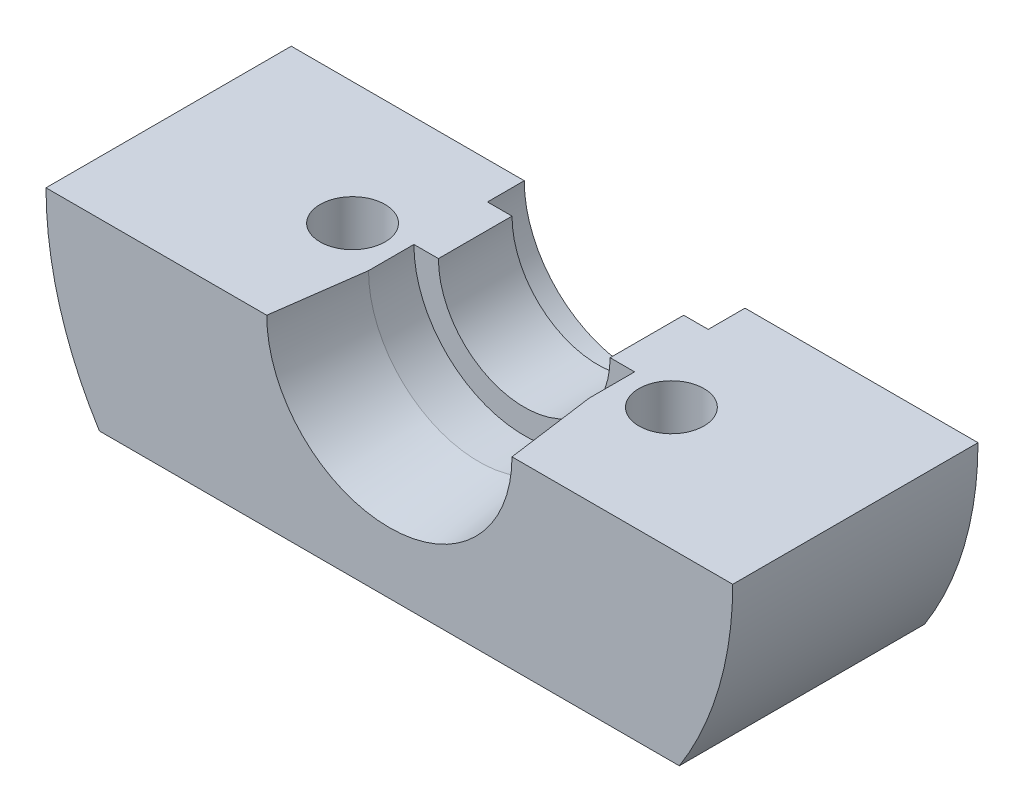
ISO-10303-21;
HEADER;
FILE_DESCRIPTION(('STEP AP214'),'2;1');
FILE_NAME('part.step','',(''),(''),'','','');
FILE_SCHEMA(('AUTOMOTIVE_DESIGN { 1 0 10303 214 1 1 1 1 }'));
ENDSEC;
DATA;
#1=APPLICATION_CONTEXT('core data for automotive mechanical design processes');
#2=APPLICATION_PROTOCOL_DEFINITION('international standard','automotive_design',2000,#1);
#3=PRODUCT_CONTEXT('',#1,'mechanical');
#4=PRODUCT('Part','Part','',(#3));
#5=PRODUCT_RELATED_PRODUCT_CATEGORY('part','',(#4));
#6=PRODUCT_DEFINITION_FORMATION('','',#4);
#7=PRODUCT_DEFINITION_CONTEXT('part definition',#1,'design');
#8=PRODUCT_DEFINITION('design','',#6,#7);
#9=PRODUCT_DEFINITION_SHAPE('','',#8);
#10=(LENGTH_UNIT() NAMED_UNIT(*) SI_UNIT(.MILLI.,.METRE.));
#11=(NAMED_UNIT(*) PLANE_ANGLE_UNIT() SI_UNIT($,.RADIAN.));
#12=(NAMED_UNIT(*) SI_UNIT($,.STERADIAN.) SOLID_ANGLE_UNIT());
#13=UNCERTAINTY_MEASURE_WITH_UNIT(LENGTH_MEASURE(1.E-05),#10,'distance_accuracy_value','');
#14=(GEOMETRIC_REPRESENTATION_CONTEXT(3) GLOBAL_UNCERTAINTY_ASSIGNED_CONTEXT((#13)) GLOBAL_UNIT_ASSIGNED_CONTEXT((#10,
#11,#12)) REPRESENTATION_CONTEXT('',''));
#15=CARTESIAN_POINT('',(0.,0.,0.));
#16=DIRECTION('',(0.,0.,1.));
#17=DIRECTION('',(1.,0.,0.));
#18=AXIS2_PLACEMENT_3D('',#15,#16,#17);
#19=CARTESIAN_POINT('',(0.,0.,-20.));
#20=DIRECTION('',(0.,0.,1.));
#21=DIRECTION('',(1.,0.,0.));
#22=AXIS2_PLACEMENT_3D('',#19,#20,#21);
#23=CYLINDRICAL_SURFACE('',#22,28.);
#24=DIRECTION('',(0.,0.,1.));
#25=VECTOR('',#24,1.);
#26=CARTESIAN_POINT('',(-23.6431808350738,-15.,-20.));
#27=LINE('',#26,#25);
#28=CARTESIAN_POINT('',(-23.6431808350738,-15.,-20.));
#29=VERTEX_POINT('',#28);
#30=CARTESIAN_POINT('',(-23.6431808350738,-15.,0.));
#31=VERTEX_POINT('',#30);
#32=EDGE_CURVE('E120',#29,#31,#27,.T.);
#33=ORIENTED_EDGE('',*,*,#32,.T.);
#34=CARTESIAN_POINT('',(0.,0.,0.));
#35=DIRECTION('',(0.,0.,1.));
#36=DIRECTION('',(1.,0.,0.));
#37=AXIS2_PLACEMENT_3D('',#34,#35,#36);
#38=CIRCLE('',#37,28.);
#39=CARTESIAN_POINT('',(-28.,0.,0.));
#40=VERTEX_POINT('',#39);
#41=EDGE_CURVE('E152',#40,#31,#38,.T.);
#42=ORIENTED_EDGE('',*,*,#41,.F.);
#43=DIRECTION('',(0.,0.,1.));
#44=VECTOR('',#43,1.);
#45=CARTESIAN_POINT('',(-28.,0.,-20.));
#46=LINE('',#45,#44);
#47=CARTESIAN_POINT('',(-28.,0.,-20.));
#48=VERTEX_POINT('',#47);
#49=EDGE_CURVE('E155',#48,#40,#46,.T.);
#50=ORIENTED_EDGE('',*,*,#49,.F.);
#51=CARTESIAN_POINT('',(0.,0.,-20.));
#52=DIRECTION('',(0.,0.,1.));
#53=DIRECTION('',(1.,0.,0.));
#54=AXIS2_PLACEMENT_3D('',#51,#52,#53);
#55=CIRCLE('',#54,28.);
#56=EDGE_CURVE('E139',#48,#29,#55,.T.);
#57=ORIENTED_EDGE('',*,*,#56,.T.);
#58=EDGE_LOOP('',(#33,#42,#50,#57));
#59=FACE_BOUND('',#58,.T.);
#60=ADVANCED_FACE('F33',(#59),#23,.T.);
#61=CARTESIAN_POINT('',(13.,0.,-10.));
#62=DIRECTION('',(0.,1.,0.));
#63=DIRECTION('',(0.,0.,1.));
#64=AXIS2_PLACEMENT_3D('',#61,#62,#63);
#65=CYLINDRICAL_SURFACE('',#64,2.64999999999999);
#66=CARTESIAN_POINT('',(13.,0.,-10.));
#67=DIRECTION('',(0.,1.,0.));
#68=DIRECTION('',(0.,0.,1.));
#69=AXIS2_PLACEMENT_3D('',#66,#67,#68);
#70=CIRCLE('',#69,2.65);
#71=CARTESIAN_POINT('',(13.,0.,-7.35000000000001));
#72=VERTEX_POINT('',#71);
#73=EDGE_CURVE('E183',#72,#72,#70,.T.);
#74=ORIENTED_EDGE('',*,*,#73,.T.);
#75=EDGE_LOOP('',(#74));
#76=FACE_BOUND('',#75,.T.);
#77=CARTESIAN_POINT('',(13.,-8.,-10.));
#78=DIRECTION('',(0.,-1.,0.));
#79=DIRECTION('',(0.,0.,-1.));
#80=AXIS2_PLACEMENT_3D('',#77,#78,#79);
#81=CIRCLE('',#80,2.64999999999999);
#82=CARTESIAN_POINT('',(13.,-8.,-12.65));
#83=VERTEX_POINT('',#82);
#84=EDGE_CURVE('E176',#83,#83,#81,.F.);
#85=ORIENTED_EDGE('',*,*,#84,.F.);
#86=EDGE_LOOP('',(#85));
#87=FACE_BOUND('',#86,.T.);
#88=ADVANCED_FACE('F264',(#76,#87),#65,.F.);
#89=CARTESIAN_POINT('',(-13.,0.,-10.));
#90=DIRECTION('',(0.,1.,0.));
#91=DIRECTION('',(0.,0.,1.));
#92=AXIS2_PLACEMENT_3D('',#89,#90,#91);
#93=CYLINDRICAL_SURFACE('',#92,2.64999999999999);
#94=CARTESIAN_POINT('',(-13.,0.,-10.));
#95=DIRECTION('',(0.,1.,0.));
#96=DIRECTION('',(0.,0.,1.));
#97=AXIS2_PLACEMENT_3D('',#94,#95,#96);
#98=CIRCLE('',#97,2.64999999999999);
#99=CARTESIAN_POINT('',(-13.,0.,-7.35000000000001));
#100=VERTEX_POINT('',#99);
#101=EDGE_CURVE('E179',#100,#100,#98,.T.);
#102=ORIENTED_EDGE('',*,*,#101,.T.);
#103=EDGE_LOOP('',(#102));
#104=FACE_BOUND('',#103,.T.);
#105=CARTESIAN_POINT('',(-13.,-8.,-10.));
#106=DIRECTION('',(0.,-1.,0.));
#107=DIRECTION('',(0.,0.,-1.));
#108=AXIS2_PLACEMENT_3D('',#105,#106,#107);
#109=CIRCLE('',#108,2.64999999999999);
#110=CARTESIAN_POINT('',(-13.,-8.,-12.65));
#111=VERTEX_POINT('',#110);
#112=EDGE_CURVE('E174',#111,#111,#109,.F.);
#113=ORIENTED_EDGE('',*,*,#112,.F.);
#114=EDGE_LOOP('',(#113));
#115=FACE_BOUND('',#114,.T.);
#116=ADVANCED_FACE('F268',(#104,#115),#93,.F.);
#117=CARTESIAN_POINT('',(-28.,0.,-20.));
#118=DIRECTION('',(0.,1.,0.));
#119=DIRECTION('',(0.,0.,1.));
#120=AXIS2_PLACEMENT_3D('',#117,#118,#119);
#121=PLANE('',#120);
#122=ORIENTED_EDGE('',*,*,#101,.F.);
#123=EDGE_LOOP('',(#122));
#124=FACE_BOUND('',#123,.T.);
#125=DIRECTION('',(-0.135718821291498,0.,0.99074739542794));
#126=VECTOR('',#125,1.);
#127=CARTESIAN_POINT('',(0.,0.,-73.0000000000002));
#128=LINE('',#127,#126);
#129=CARTESIAN_POINT('',(-9.,0.,-7.3));
#130=VERTEX_POINT('',#129);
#131=CARTESIAN_POINT('',(-10.,0.,0.));
#132=VERTEX_POINT('',#131);
#133=EDGE_CURVE('E58',#130,#132,#128,.T.);
#134=ORIENTED_EDGE('',*,*,#133,.F.);
#135=DIRECTION('',(0.,0.,1.));
#136=VECTOR('',#135,1.);
#137=CARTESIAN_POINT('',(-9.,0.,0.));
#138=LINE('',#137,#136);
#139=CARTESIAN_POINT('',(-9.,0.,-11.));
#140=VERTEX_POINT('',#139);
#141=EDGE_CURVE('E11',#140,#130,#138,.T.);
#142=ORIENTED_EDGE('',*,*,#141,.F.);
#143=DIRECTION('',(-1.,0.,0.));
#144=VECTOR('',#143,1.);
#145=CARTESIAN_POINT('',(-28.,0.,-11.));
#146=LINE('',#145,#144);
#147=CARTESIAN_POINT('',(-7.,0.,-11.));
#148=VERTEX_POINT('',#147);
#149=EDGE_CURVE('E42',#148,#140,#146,.T.);
#150=ORIENTED_EDGE('',*,*,#149,.F.);
#151=DIRECTION('',(0.,0.,1.));
#152=VECTOR('',#151,1.);
#153=CARTESIAN_POINT('',(-7.,0.,0.));
#154=LINE('',#153,#152);
#155=CARTESIAN_POINT('',(-7.,0.,-17.));
#156=VERTEX_POINT('',#155);
#157=EDGE_CURVE('E172',#156,#148,#154,.T.);
#158=ORIENTED_EDGE('',*,*,#157,.F.);
#159=DIRECTION('',(1.,0.,0.));
#160=VECTOR('',#159,1.);
#161=CARTESIAN_POINT('',(-28.,0.,-17.));
#162=LINE('',#161,#160);
#163=CARTESIAN_POINT('',(-9.,0.,-17.));
#164=VERTEX_POINT('',#163);
#165=EDGE_CURVE('E166',#164,#156,#162,.T.);
#166=ORIENTED_EDGE('',*,*,#165,.F.);
#167=DIRECTION('',(0.,0.,1.));
#168=VECTOR('',#167,1.);
#169=CARTESIAN_POINT('',(-9.,0.,0.));
#170=LINE('',#169,#168);
#171=CARTESIAN_POINT('',(-9.,0.,-20.));
#172=VERTEX_POINT('',#171);
#173=EDGE_CURVE('E148',#172,#164,#170,.T.);
#174=ORIENTED_EDGE('',*,*,#173,.F.);
#175=DIRECTION('',(-1.,0.,0.));
#176=VECTOR('',#175,1.);
#177=CARTESIAN_POINT('',(-28.,0.,-20.));
#178=LINE('',#177,#176);
#179=EDGE_CURVE('E142',#172,#48,#178,.T.);
#180=ORIENTED_EDGE('',*,*,#179,.T.);
#181=ORIENTED_EDGE('',*,*,#49,.T.);
#182=DIRECTION('',(-1.,0.,0.));
#183=VECTOR('',#182,1.);
#184=CARTESIAN_POINT('',(-28.,0.,0.));
#185=LINE('',#184,#183);
#186=EDGE_CURVE('E144',#132,#40,#185,.T.);
#187=ORIENTED_EDGE('',*,*,#186,.F.);
#188=EDGE_LOOP('',(#134,#142,#150,#158,#166,#174,#180,#181,#187));
#189=FACE_BOUND('',#188,.T.);
#190=ADVANCED_FACE('F230',(#124,#189),#121,.T.);
#191=DIRECTION('',(0.,0.,1.));
#192=VECTOR('',#191,1.);
#193=CARTESIAN_POINT('',(23.6431808350738,-15.,-20.));
#194=LINE('',#193,#192);
#195=CARTESIAN_POINT('',(23.6431808350738,-15.,-20.));
#196=VERTEX_POINT('',#195);
#197=CARTESIAN_POINT('',(23.6431808350738,-15.,0.));
#198=VERTEX_POINT('',#197);
#199=EDGE_CURVE('E50',#196,#198,#194,.T.);
#200=ORIENTED_EDGE('',*,*,#199,.F.);
#201=CARTESIAN_POINT('',(28.,0.,-20.));
#202=VERTEX_POINT('',#201);
#203=EDGE_CURVE('E130',#196,#202,#55,.T.);
#204=ORIENTED_EDGE('',*,*,#203,.T.);
#205=DIRECTION('',(0.,0.,1.));
#206=VECTOR('',#205,1.);
#207=CARTESIAN_POINT('',(28.,0.,-20.));
#208=LINE('',#207,#206);
#209=CARTESIAN_POINT('',(28.,0.,0.));
#210=VERTEX_POINT('',#209);
#211=EDGE_CURVE('E151',#202,#210,#208,.T.);
#212=ORIENTED_EDGE('',*,*,#211,.T.);
#213=EDGE_CURVE('E132',#198,#210,#38,.T.);
#214=ORIENTED_EDGE('',*,*,#213,.F.);
#215=EDGE_LOOP('',(#200,#204,#212,#214));
#216=FACE_BOUND('',#215,.T.);
#217=ADVANCED_FACE('F35',(#216),#23,.T.);
#218=ORIENTED_EDGE('',*,*,#73,.F.);
#219=EDGE_LOOP('',(#218));
#220=FACE_BOUND('',#219,.T.);
#221=DIRECTION('',(-0.135718821291498,0.,-0.99074739542794));
#222=VECTOR('',#221,1.);
#223=CARTESIAN_POINT('',(0.,0.,-73.0000000000002));
#224=LINE('',#223,#222);
#225=CARTESIAN_POINT('',(10.,0.,0.));
#226=VERTEX_POINT('',#225);
#227=CARTESIAN_POINT('',(9.,0.,-7.3));
#228=VERTEX_POINT('',#227);
#229=EDGE_CURVE('E208',#226,#228,#224,.T.);
#230=ORIENTED_EDGE('',*,*,#229,.F.);
#231=EDGE_CURVE('E140',#210,#226,#185,.T.);
#232=ORIENTED_EDGE('',*,*,#231,.F.);
#233=ORIENTED_EDGE('',*,*,#211,.F.);
#234=CARTESIAN_POINT('',(9.,0.,-20.));
#235=VERTEX_POINT('',#234);
#236=EDGE_CURVE('E138',#202,#235,#178,.T.);
#237=ORIENTED_EDGE('',*,*,#236,.T.);
#238=DIRECTION('',(0.,0.,1.));
#239=VECTOR('',#238,1.);
#240=CARTESIAN_POINT('',(9.,0.,0.));
#241=LINE('',#240,#239);
#242=CARTESIAN_POINT('',(9.,0.,-17.));
#243=VERTEX_POINT('',#242);
#244=EDGE_CURVE('E210',#243,#235,#241,.F.);
#245=ORIENTED_EDGE('',*,*,#244,.F.);
#246=CARTESIAN_POINT('',(7.,0.,-17.));
#247=VERTEX_POINT('',#246);
#248=EDGE_CURVE('E163',#247,#243,#162,.T.);
#249=ORIENTED_EDGE('',*,*,#248,.F.);
#250=DIRECTION('',(0.,0.,1.));
#251=VECTOR('',#250,1.);
#252=CARTESIAN_POINT('',(7.,0.,0.));
#253=LINE('',#252,#251);
#254=CARTESIAN_POINT('',(7.,0.,-11.));
#255=VERTEX_POINT('',#254);
#256=EDGE_CURVE('E165',#255,#247,#253,.F.);
#257=ORIENTED_EDGE('',*,*,#256,.F.);
#258=CARTESIAN_POINT('',(9.,0.,-11.));
#259=VERTEX_POINT('',#258);
#260=EDGE_CURVE('E168',#259,#255,#146,.T.);
#261=ORIENTED_EDGE('',*,*,#260,.F.);
#262=DIRECTION('',(0.,0.,1.));
#263=VECTOR('',#262,1.);
#264=CARTESIAN_POINT('',(9.,0.,0.));
#265=LINE('',#264,#263);
#266=EDGE_CURVE('E170',#228,#259,#265,.F.);
#267=ORIENTED_EDGE('',*,*,#266,.F.);
#268=EDGE_LOOP('',(#230,#232,#233,#237,#245,#249,#257,#261,#267));
#269=FACE_BOUND('',#268,.T.);
#270=ADVANCED_FACE('F220',(#220,#269),#121,.T.);
#271=CARTESIAN_POINT('',(0.,0.,-20.));
#272=DIRECTION('',(0.,0.,1.));
#273=DIRECTION('',(1.,0.,0.));
#274=AXIS2_PLACEMENT_3D('',#271,#272,#273);
#275=PLANE('',#274);
#276=ORIENTED_EDGE('',*,*,#203,.F.);
#277=DIRECTION('',(-1.,0.,0.));
#278=VECTOR('',#277,1.);
#279=CARTESIAN_POINT('',(-23.6431808350738,-15.,-20.));
#280=LINE('',#279,#278);
#281=EDGE_CURVE('E116',#196,#29,#280,.T.);
#282=ORIENTED_EDGE('',*,*,#281,.T.);
#283=ORIENTED_EDGE('',*,*,#56,.F.);
#284=ORIENTED_EDGE('',*,*,#179,.F.);
#285=CARTESIAN_POINT('',(0.,0.,-20.));
#286=DIRECTION('',(0.,0.,1.));
#287=DIRECTION('',(1.,0.,0.));
#288=AXIS2_PLACEMENT_3D('',#285,#286,#287);
#289=CIRCLE('',#288,9.);
#290=EDGE_CURVE('E161',#172,#235,#289,.T.);
#291=ORIENTED_EDGE('',*,*,#290,.T.);
#292=ORIENTED_EDGE('',*,*,#236,.F.);
#293=EDGE_LOOP('',(#276,#282,#283,#284,#291,#292));
#294=FACE_BOUND('',#293,.T.);
#295=ADVANCED_FACE('F135',(#294),#275,.F.);
#296=CARTESIAN_POINT('',(0.,0.,0.));
#297=DIRECTION('',(0.,0.,1.));
#298=DIRECTION('',(1.,0.,0.));
#299=AXIS2_PLACEMENT_3D('',#296,#297,#298);
#300=PLANE('',#299);
#301=DIRECTION('',(-1.,0.,0.));
#302=VECTOR('',#301,1.);
#303=CARTESIAN_POINT('',(-23.6431808350738,-15.,0.));
#304=LINE('',#303,#302);
#305=EDGE_CURVE('E125',#198,#31,#304,.T.);
#306=ORIENTED_EDGE('',*,*,#305,.F.);
#307=ORIENTED_EDGE('',*,*,#213,.T.);
#308=ORIENTED_EDGE('',*,*,#231,.T.);
#309=CARTESIAN_POINT('',(0.,0.,0.));
#310=DIRECTION('',(0.,0.,1.));
#311=DIRECTION('',(1.,0.,0.));
#312=AXIS2_PLACEMENT_3D('',#309,#310,#311);
#313=CIRCLE('',#312,10.);
#314=EDGE_CURVE('E158',#132,#226,#313,.T.);
#315=ORIENTED_EDGE('',*,*,#314,.F.);
#316=ORIENTED_EDGE('',*,*,#186,.T.);
#317=ORIENTED_EDGE('',*,*,#41,.T.);
#318=EDGE_LOOP('',(#306,#307,#308,#315,#316,#317));
#319=FACE_BOUND('',#318,.T.);
#320=ADVANCED_FACE('F216',(#319),#300,.T.);
#321=CARTESIAN_POINT('',(0.,0.,0.));
#322=DIRECTION('',(0.,0.,1.));
#323=DIRECTION('',(1.,0.,0.));
#324=AXIS2_PLACEMENT_3D('',#321,#322,#323);
#325=CONICAL_SURFACE('',#324,10.,0.13613896085314);
#326=ORIENTED_EDGE('',*,*,#133,.T.);
#327=ORIENTED_EDGE('',*,*,#314,.T.);
#328=ORIENTED_EDGE('',*,*,#229,.T.);
#329=CARTESIAN_POINT('',(0.,0.,-7.3));
#330=DIRECTION('',(0.,0.,1.));
#331=DIRECTION('',(1.,0.,0.));
#332=AXIS2_PLACEMENT_3D('',#329,#330,#331);
#333=CIRCLE('',#332,9.);
#334=EDGE_CURVE('E205',#130,#228,#333,.T.);
#335=ORIENTED_EDGE('',*,*,#334,.F.);
#336=EDGE_LOOP('',(#326,#327,#328,#335));
#337=FACE_BOUND('',#336,.T.);
#338=ADVANCED_FACE('F223',(#337),#325,.F.);
#339=CARTESIAN_POINT('',(0.,0.,0.));
#340=DIRECTION('',(0.,0.,1.));
#341=DIRECTION('',(1.,0.,0.));
#342=AXIS2_PLACEMENT_3D('',#339,#340,#341);
#343=CYLINDRICAL_SURFACE('',#342,9.);
#344=ORIENTED_EDGE('',*,*,#141,.T.);
#345=ORIENTED_EDGE('',*,*,#334,.T.);
#346=ORIENTED_EDGE('',*,*,#266,.T.);
#347=CARTESIAN_POINT('',(0.,0.,-11.));
#348=DIRECTION('',(0.,0.,1.));
#349=DIRECTION('',(1.,0.,0.));
#350=AXIS2_PLACEMENT_3D('',#347,#348,#349);
#351=CIRCLE('',#350,9.);
#352=EDGE_CURVE('E202',#140,#259,#351,.T.);
#353=ORIENTED_EDGE('',*,*,#352,.F.);
#354=EDGE_LOOP('',(#344,#345,#346,#353));
#355=FACE_BOUND('',#354,.T.);
#356=ADVANCED_FACE('F225',(#355),#343,.F.);
#357=CARTESIAN_POINT('',(9.,0.,-11.));
#358=DIRECTION('',(0.,0.,-1.));
#359=DIRECTION('',(-1.,0.,0.));
#360=AXIS2_PLACEMENT_3D('',#357,#358,#359);
#361=PLANE('',#360);
#362=ORIENTED_EDGE('',*,*,#260,.T.);
#363=CARTESIAN_POINT('',(0.,0.,-11.));
#364=DIRECTION('',(0.,0.,1.));
#365=DIRECTION('',(1.,0.,0.));
#366=AXIS2_PLACEMENT_3D('',#363,#364,#365);
#367=CIRCLE('',#366,7.);
#368=EDGE_CURVE('E199',#148,#255,#367,.T.);
#369=ORIENTED_EDGE('',*,*,#368,.F.);
#370=ORIENTED_EDGE('',*,*,#149,.T.);
#371=ORIENTED_EDGE('',*,*,#352,.T.);
#372=EDGE_LOOP('',(#362,#369,#370,#371));
#373=FACE_BOUND('',#372,.T.);
#374=ADVANCED_FACE('F290',(#373),#361,.F.);
#375=CARTESIAN_POINT('',(0.,0.,0.));
#376=DIRECTION('',(0.,0.,1.));
#377=DIRECTION('',(1.,0.,0.));
#378=AXIS2_PLACEMENT_3D('',#375,#376,#377);
#379=CYLINDRICAL_SURFACE('',#378,7.);
#380=ORIENTED_EDGE('',*,*,#157,.T.);
#381=ORIENTED_EDGE('',*,*,#368,.T.);
#382=ORIENTED_EDGE('',*,*,#256,.T.);
#383=CARTESIAN_POINT('',(0.,0.,-17.));
#384=DIRECTION('',(0.,0.,1.));
#385=DIRECTION('',(1.,0.,0.));
#386=AXIS2_PLACEMENT_3D('',#383,#384,#385);
#387=CIRCLE('',#386,7.);
#388=EDGE_CURVE('E196',#156,#247,#387,.T.);
#389=ORIENTED_EDGE('',*,*,#388,.F.);
#390=EDGE_LOOP('',(#380,#381,#382,#389));
#391=FACE_BOUND('',#390,.T.);
#392=ADVANCED_FACE('F293',(#391),#379,.F.);
#393=CARTESIAN_POINT('',(7.,0.,-17.));
#394=DIRECTION('',(0.,0.,1.));
#395=DIRECTION('',(1.,0.,0.));
#396=AXIS2_PLACEMENT_3D('',#393,#394,#395);
#397=PLANE('',#396);
#398=ORIENTED_EDGE('',*,*,#165,.T.);
#399=ORIENTED_EDGE('',*,*,#388,.T.);
#400=ORIENTED_EDGE('',*,*,#248,.T.);
#401=CARTESIAN_POINT('',(0.,0.,-17.));
#402=DIRECTION('',(0.,0.,1.));
#403=DIRECTION('',(1.,0.,0.));
#404=AXIS2_PLACEMENT_3D('',#401,#402,#403);
#405=CIRCLE('',#404,9.);
#406=EDGE_CURVE('E188',#164,#243,#405,.T.);
#407=ORIENTED_EDGE('',*,*,#406,.F.);
#408=EDGE_LOOP('',(#398,#399,#400,#407));
#409=FACE_BOUND('',#408,.T.);
#410=ADVANCED_FACE('F297',(#409),#397,.F.);
#411=CARTESIAN_POINT('',(0.,0.,0.));
#412=DIRECTION('',(0.,0.,1.));
#413=DIRECTION('',(1.,0.,0.));
#414=AXIS2_PLACEMENT_3D('',#411,#412,#413);
#415=CYLINDRICAL_SURFACE('',#414,9.);
#416=ORIENTED_EDGE('',*,*,#173,.T.);
#417=ORIENTED_EDGE('',*,*,#406,.T.);
#418=ORIENTED_EDGE('',*,*,#244,.T.);
#419=ORIENTED_EDGE('',*,*,#290,.F.);
#420=EDGE_LOOP('',(#416,#417,#418,#419));
#421=FACE_BOUND('',#420,.T.);
#422=ADVANCED_FACE('F301',(#421),#415,.F.);
#423=CARTESIAN_POINT('',(-13.,-8.,-10.));
#424=DIRECTION('',(0.,-1.,0.));
#425=DIRECTION('',(0.,0.,-1.));
#426=AXIS2_PLACEMENT_3D('',#423,#424,#425);
#427=PLANE('',#426);
#428=CARTESIAN_POINT('',(-13.,-8.,-10.));
#429=DIRECTION('',(0.,-1.,0.));
#430=DIRECTION('',(0.,0.,-1.));
#431=AXIS2_PLACEMENT_3D('',#428,#429,#430);
#432=CIRCLE('',#431,4.5);
#433=CARTESIAN_POINT('',(-13.,-8.,-14.5));
#434=VERTEX_POINT('',#433);
#435=EDGE_CURVE('E177',#434,#434,#432,.T.);
#436=ORIENTED_EDGE('',*,*,#435,.T.);
#437=EDGE_LOOP('',(#436));
#438=FACE_BOUND('',#437,.T.);
#439=ORIENTED_EDGE('',*,*,#112,.T.);
#440=EDGE_LOOP('',(#439));
#441=FACE_BOUND('',#440,.T.);
#442=ADVANCED_FACE('F304',(#438,#441),#427,.T.);
#443=CARTESIAN_POINT('',(-13.,-8.,-10.));
#444=DIRECTION('',(0.,-1.,0.));
#445=DIRECTION('',(0.,0.,-1.));
#446=AXIS2_PLACEMENT_3D('',#443,#444,#445);
#447=CYLINDRICAL_SURFACE('',#446,4.5);
#448=CARTESIAN_POINT('',(-13.,-15.,-10.));
#449=DIRECTION('',(0.,1.,0.));
#450=DIRECTION('',(0.,0.,1.));
#451=AXIS2_PLACEMENT_3D('',#448,#449,#450);
#452=CIRCLE('',#451,4.5);
#453=CARTESIAN_POINT('',(-13.,-15.,-5.5));
#454=VERTEX_POINT('',#453);
#455=EDGE_CURVE('E238',#454,#454,#452,.F.);
#456=ORIENTED_EDGE('',*,*,#455,.T.);
#457=EDGE_LOOP('',(#456));
#458=FACE_BOUND('',#457,.T.);
#459=ORIENTED_EDGE('',*,*,#435,.F.);
#460=EDGE_LOOP('',(#459));
#461=FACE_BOUND('',#460,.T.);
#462=ADVANCED_FACE('F260',(#458,#461),#447,.F.);
#463=CARTESIAN_POINT('',(13.,-8.,-10.));
#464=DIRECTION('',(0.,-1.,0.));
#465=DIRECTION('',(0.,0.,-1.));
#466=AXIS2_PLACEMENT_3D('',#463,#464,#465);
#467=PLANE('',#466);
#468=CARTESIAN_POINT('',(13.,-8.,-10.));
#469=DIRECTION('',(0.,-1.,0.));
#470=DIRECTION('',(0.,0.,-1.));
#471=AXIS2_PLACEMENT_3D('',#468,#469,#470);
#472=CIRCLE('',#471,4.5);
#473=CARTESIAN_POINT('',(13.,-8.,-14.5));
#474=VERTEX_POINT('',#473);
#475=EDGE_CURVE('E191',#474,#474,#472,.T.);
#476=ORIENTED_EDGE('',*,*,#475,.T.);
#477=EDGE_LOOP('',(#476));
#478=FACE_BOUND('',#477,.T.);
#479=ORIENTED_EDGE('',*,*,#84,.T.);
#480=EDGE_LOOP('',(#479));
#481=FACE_BOUND('',#480,.T.);
#482=ADVANCED_FACE('F248',(#478,#481),#467,.T.);
#483=CARTESIAN_POINT('',(13.,-8.,-10.));
#484=DIRECTION('',(0.,-1.,0.));
#485=DIRECTION('',(0.,0.,-1.));
#486=AXIS2_PLACEMENT_3D('',#483,#484,#485);
#487=CYLINDRICAL_SURFACE('',#486,4.5);
#488=CARTESIAN_POINT('',(13.,-15.,-10.));
#489=DIRECTION('',(0.,1.,0.));
#490=DIRECTION('',(0.,0.,1.));
#491=AXIS2_PLACEMENT_3D('',#488,#489,#490);
#492=CIRCLE('',#491,4.5);
#493=CARTESIAN_POINT('',(13.,-15.,-5.5));
#494=VERTEX_POINT('',#493);
#495=EDGE_CURVE('E37',#494,#494,#492,.F.);
#496=ORIENTED_EDGE('',*,*,#495,.T.);
#497=EDGE_LOOP('',(#496));
#498=FACE_BOUND('',#497,.T.);
#499=ORIENTED_EDGE('',*,*,#475,.F.);
#500=EDGE_LOOP('',(#499));
#501=FACE_BOUND('',#500,.T.);
#502=ADVANCED_FACE('F250',(#498,#501),#487,.F.);
#503=CARTESIAN_POINT('',(-23.6431808350738,-15.,-20.));
#504=DIRECTION('',(0.,1.,0.));
#505=DIRECTION('',(0.,0.,1.));
#506=AXIS2_PLACEMENT_3D('',#503,#504,#505);
#507=PLANE('',#506);
#508=ORIENTED_EDGE('',*,*,#495,.F.);
#509=EDGE_LOOP('',(#508));
#510=FACE_BOUND('',#509,.T.);
#511=ORIENTED_EDGE('',*,*,#305,.T.);
#512=ORIENTED_EDGE('',*,*,#32,.F.);
#513=ORIENTED_EDGE('',*,*,#281,.F.);
#514=ORIENTED_EDGE('',*,*,#199,.T.);
#515=EDGE_LOOP('',(#511,#512,#513,#514));
#516=FACE_BOUND('',#515,.T.);
#517=ORIENTED_EDGE('',*,*,#455,.F.);
#518=EDGE_LOOP('',(#517));
#519=FACE_BOUND('',#518,.T.);
#520=ADVANCED_FACE('F117',(#510,#516,#519),#507,.F.);
#521=CLOSED_SHELL('',(#60,#88,#116,#190,#217,#270,#295,#320,#338,#356,#374,#392,#410,#422,#442,
#462,#482,#502,#520));
#522=MANIFOLD_SOLID_BREP('B2',#521);
#523=ADVANCED_BREP_SHAPE_REPRESENTATION('',(#18,#522),#14);
#524=SHAPE_DEFINITION_REPRESENTATION(#9,#523);
ENDSEC;
END-ISO-10303-21;
